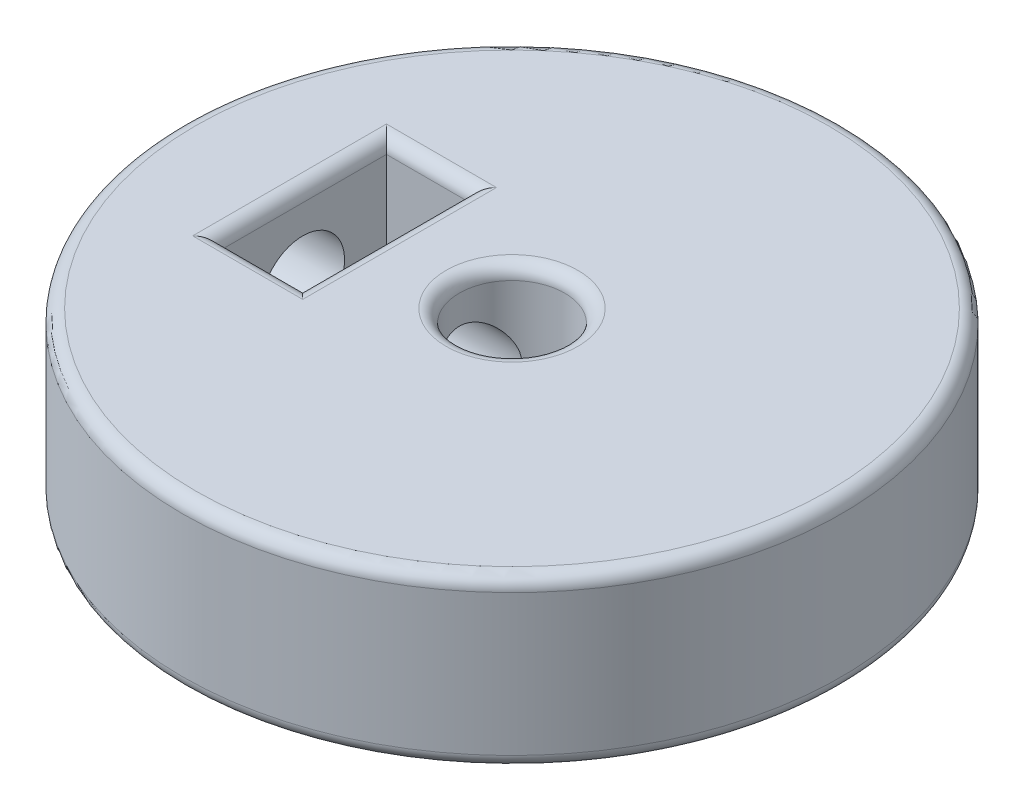
ISO-10303-21;
HEADER;
FILE_DESCRIPTION(('STEP AP214'),'2;1');
FILE_NAME('part.step','',(''),(''),'','','');
FILE_SCHEMA(('AUTOMOTIVE_DESIGN { 1 0 10303 214 1 1 1 1 }'));
ENDSEC;
DATA;
#1=APPLICATION_CONTEXT('core data for automotive mechanical design processes');
#2=APPLICATION_PROTOCOL_DEFINITION('international standard','automotive_design',2000,#1);
#3=PRODUCT_CONTEXT('',#1,'mechanical');
#4=PRODUCT('Part','Part','',(#3));
#5=PRODUCT_RELATED_PRODUCT_CATEGORY('part','',(#4));
#6=PRODUCT_DEFINITION_FORMATION('','',#4);
#7=PRODUCT_DEFINITION_CONTEXT('part definition',#1,'design');
#8=PRODUCT_DEFINITION('design','',#6,#7);
#9=PRODUCT_DEFINITION_SHAPE('','',#8);
#10=(LENGTH_UNIT() NAMED_UNIT(*) SI_UNIT(.MILLI.,.METRE.));
#11=(NAMED_UNIT(*) PLANE_ANGLE_UNIT() SI_UNIT($,.RADIAN.));
#12=(NAMED_UNIT(*) SI_UNIT($,.STERADIAN.) SOLID_ANGLE_UNIT());
#13=UNCERTAINTY_MEASURE_WITH_UNIT(LENGTH_MEASURE(1.E-05),#10,'distance_accuracy_value','');
#14=(GEOMETRIC_REPRESENTATION_CONTEXT(3) GLOBAL_UNCERTAINTY_ASSIGNED_CONTEXT((#13)) GLOBAL_UNIT_ASSIGNED_CONTEXT((#10,
#11,#12)) REPRESENTATION_CONTEXT('',''));
#15=CARTESIAN_POINT('',(0.,0.,0.));
#16=DIRECTION('',(0.,0.,1.));
#17=DIRECTION('',(1.,0.,0.));
#18=AXIS2_PLACEMENT_3D('',#15,#16,#17);
#19=CARTESIAN_POINT('',(0.,12.7,0.));
#20=DIRECTION('',(0.,1.,0.));
#21=DIRECTION('',(0.,0.,1.));
#22=AXIS2_PLACEMENT_3D('',#19,#20,#21);
#23=PLANE('',#22);
#24=CARTESIAN_POINT('',(0.,12.7,0.));
#25=DIRECTION('',(0.,1.,0.));
#26=DIRECTION('',(0.,0.,1.));
#27=AXIS2_PLACEMENT_3D('',#24,#25,#26);
#28=CIRCLE('',#27,5.);
#29=CARTESIAN_POINT('',(0.,12.7,5.));
#30=VERTEX_POINT('',#29);
#31=EDGE_CURVE('E11',#30,#30,#28,.F.);
#32=ORIENTED_EDGE('',*,*,#31,.T.);
#33=EDGE_LOOP('',(#32));
#34=FACE_BOUND('',#33,.T.);
#35=CARTESIAN_POINT('',(0.,12.7,0.));
#36=DIRECTION('',(0.,1.,0.));
#37=DIRECTION('',(0.,0.,1.));
#38=AXIS2_PLACEMENT_3D('',#35,#36,#37);
#39=CIRCLE('',#38,24.);
#40=CARTESIAN_POINT('',(0.,12.7,24.));
#41=VERTEX_POINT('',#40);
#42=EDGE_CURVE('E42',#41,#41,#39,.T.);
#43=ORIENTED_EDGE('',*,*,#42,.T.);
#44=EDGE_LOOP('',(#43));
#45=FACE_BOUND('',#44,.T.);
#46=DIRECTION('',(0.,0.,-1.));
#47=VECTOR('',#46,1.);
#48=CARTESIAN_POINT('',(-8.525,12.7,6.35));
#49=LINE('',#48,#47);
#50=CARTESIAN_POINT('',(-8.525,12.7,-7.35));
#51=VERTEX_POINT('',#50);
#52=CARTESIAN_POINT('',(-8.525,12.7,7.35));
#53=VERTEX_POINT('',#52);
#54=EDGE_CURVE('E50',#51,#53,#49,.F.);
#55=ORIENTED_EDGE('',*,*,#54,.T.);
#56=DIRECTION('',(1.,0.,0.));
#57=VECTOR('',#56,1.);
#58=CARTESIAN_POINT('',(-15.875,12.7,7.35));
#59=LINE('',#58,#57);
#60=CARTESIAN_POINT('',(-16.875,12.7,7.35));
#61=VERTEX_POINT('',#60);
#62=EDGE_CURVE('E168',#53,#61,#59,.F.);
#63=ORIENTED_EDGE('',*,*,#62,.T.);
#64=DIRECTION('',(0.,0.,1.));
#65=VECTOR('',#64,1.);
#66=CARTESIAN_POINT('',(-16.875,12.7,-6.35));
#67=LINE('',#66,#65);
#68=CARTESIAN_POINT('',(-16.875,12.7,-7.35));
#69=VERTEX_POINT('',#68);
#70=EDGE_CURVE('E164',#61,#69,#67,.F.);
#71=ORIENTED_EDGE('',*,*,#70,.T.);
#72=DIRECTION('',(-1.,0.,0.));
#73=VECTOR('',#72,1.);
#74=CARTESIAN_POINT('',(-9.525,12.7,-7.35));
#75=LINE('',#74,#73);
#76=EDGE_CURVE('E55',#69,#51,#75,.F.);
#77=ORIENTED_EDGE('',*,*,#76,.T.);
#78=EDGE_LOOP('',(#55,#63,#71,#77));
#79=FACE_BOUND('',#78,.T.);
#80=ADVANCED_FACE('F33',(#34,#45,#79),#23,.T.);
#81=CARTESIAN_POINT('',(0.,0.,0.));
#82=DIRECTION('',(0.,1.,0.));
#83=DIRECTION('',(0.,0.,1.));
#84=AXIS2_PLACEMENT_3D('',#81,#82,#83);
#85=PLANE('',#84);
#86=CARTESIAN_POINT('',(0.,0.,0.));
#87=DIRECTION('',(0.,1.,0.));
#88=DIRECTION('',(0.,0.,1.));
#89=AXIS2_PLACEMENT_3D('',#86,#87,#88);
#90=CIRCLE('',#89,5.);
#91=CARTESIAN_POINT('',(0.,0.,5.));
#92=VERTEX_POINT('',#91);
#93=EDGE_CURVE('E129',#92,#92,#90,.T.);
#94=ORIENTED_EDGE('',*,*,#93,.T.);
#95=EDGE_LOOP('',(#94));
#96=FACE_BOUND('',#95,.T.);
#97=CARTESIAN_POINT('',(0.,0.,0.));
#98=DIRECTION('',(0.,1.,0.));
#99=DIRECTION('',(0.,0.,1.));
#100=AXIS2_PLACEMENT_3D('',#97,#98,#99);
#101=CIRCLE('',#100,24.);
#102=CARTESIAN_POINT('',(0.,0.,24.));
#103=VERTEX_POINT('',#102);
#104=EDGE_CURVE('E126',#103,#103,#101,.F.);
#105=ORIENTED_EDGE('',*,*,#104,.T.);
#106=EDGE_LOOP('',(#105));
#107=FACE_BOUND('',#106,.T.);
#108=DIRECTION('',(1.,0.,0.));
#109=VECTOR('',#108,1.);
#110=CARTESIAN_POINT('',(0.,0.,7.35));
#111=LINE('',#110,#109);
#112=CARTESIAN_POINT('',(-16.875,0.,7.35));
#113=VERTEX_POINT('',#112);
#114=CARTESIAN_POINT('',(-8.525,0.,7.35));
#115=VERTEX_POINT('',#114);
#116=EDGE_CURVE('E124',#113,#115,#111,.T.);
#117=ORIENTED_EDGE('',*,*,#116,.T.);
#118=DIRECTION('',(0.,0.,-1.));
#119=VECTOR('',#118,1.);
#120=CARTESIAN_POINT('',(-8.525,0.,0.));
#121=LINE('',#120,#119);
#122=CARTESIAN_POINT('',(-8.525,0.,-7.35));
#123=VERTEX_POINT('',#122);
#124=EDGE_CURVE('E105',#115,#123,#121,.T.);
#125=ORIENTED_EDGE('',*,*,#124,.T.);
#126=DIRECTION('',(-1.,0.,0.));
#127=VECTOR('',#126,1.);
#128=CARTESIAN_POINT('',(0.,0.,-7.35));
#129=LINE('',#128,#127);
#130=CARTESIAN_POINT('',(-16.875,0.,-7.35));
#131=VERTEX_POINT('',#130);
#132=EDGE_CURVE('E113',#123,#131,#129,.T.);
#133=ORIENTED_EDGE('',*,*,#132,.T.);
#134=DIRECTION('',(0.,0.,1.));
#135=VECTOR('',#134,1.);
#136=CARTESIAN_POINT('',(-16.875,0.,0.));
#137=LINE('',#136,#135);
#138=EDGE_CURVE('E119',#131,#113,#137,.T.);
#139=ORIENTED_EDGE('',*,*,#138,.T.);
#140=EDGE_LOOP('',(#117,#125,#133,#139));
#141=FACE_BOUND('',#140,.T.);
#142=ADVANCED_FACE('F122',(#96,#107,#141),#85,.F.);
#143=CARTESIAN_POINT('',(0.,12.7,0.));
#144=DIRECTION('',(0.,-1.,0.));
#145=DIRECTION('',(0.,0.,-1.));
#146=AXIS2_PLACEMENT_3D('',#143,#144,#145);
#147=CYLINDRICAL_SURFACE('',#146,25.);
#148=CARTESIAN_POINT('',(0.,1.,0.));
#149=DIRECTION('',(0.,1.,0.));
#150=DIRECTION('',(0.,0.,1.));
#151=AXIS2_PLACEMENT_3D('',#148,#149,#150);
#152=CIRCLE('',#151,25.);
#153=CARTESIAN_POINT('',(0.,1.,25.));
#154=VERTEX_POINT('',#153);
#155=EDGE_CURVE('E145',#154,#154,#152,.T.);
#156=ORIENTED_EDGE('',*,*,#155,.T.);
#157=EDGE_LOOP('',(#156));
#158=FACE_BOUND('',#157,.T.);
#159=CARTESIAN_POINT('',(0.,11.7,0.));
#160=DIRECTION('',(0.,1.,0.));
#161=DIRECTION('',(0.,0.,1.));
#162=AXIS2_PLACEMENT_3D('',#159,#160,#161);
#163=CIRCLE('',#162,25.);
#164=CARTESIAN_POINT('',(0.,11.7,25.));
#165=VERTEX_POINT('',#164);
#166=EDGE_CURVE('E142',#165,#165,#163,.F.);
#167=ORIENTED_EDGE('',*,*,#166,.T.);
#168=EDGE_LOOP('',(#167));
#169=FACE_BOUND('',#168,.T.);
#170=CARTESIAN_POINT('',(-24.797567925101,6.35,3.175));
#171=CARTESIAN_POINT('',(-24.7975705111153,6.17243213556691,3.17499246488442));
#172=CARTESIAN_POINT('',(-24.7994957854187,5.99475386935248,3.16005350047622));
#173=CARTESIAN_POINT('',(-24.8069857822236,5.64434382883282,3.10069616760941));
#174=CARTESIAN_POINT('',(-24.8125542891275,5.47161739318907,3.05624714491254));
#175=CARTESIAN_POINT('',(-24.8266900800026,5.13623501662552,2.93920267061333));
#176=CARTESIAN_POINT('',(-24.8352553088008,4.97357226370485,2.8666265051399));
#177=CARTESIAN_POINT('',(-24.8544169866335,4.66276443719102,2.69542951653762));
#178=CARTESIAN_POINT('',(-24.8650130933379,4.51461692322219,2.59681308176825));
#179=CARTESIAN_POINT('',(-24.8871111076848,4.23615994171991,2.37572524836186));
#180=CARTESIAN_POINT('',(-24.8986174043297,4.10594639487242,2.25313346419816));
#181=CARTESIAN_POINT('',(-24.9211998808118,3.86788239527623,1.98783407816174));
#182=CARTESIAN_POINT('',(-24.9322760390685,3.76003306339586,1.84512546865908));
#183=CARTESIAN_POINT('',(-24.9527952489488,3.56941410294974,1.54303961209787));
#184=CARTESIAN_POINT('',(-24.9622325927008,3.48673140410834,1.38360709088167));
#185=CARTESIAN_POINT('',(-24.9783625733138,3.34934963950978,1.05297955301708));
#186=CARTESIAN_POINT('',(-24.9850553151895,3.29464950305568,0.88178498670425));
#187=CARTESIAN_POINT('',(-24.9949110868013,3.21507252010342,0.533474532777816));
#188=CARTESIAN_POINT('',(-24.9980929964501,3.19003609921958,0.356395645210083));
#189=CARTESIAN_POINT('',(-25.0006330769807,3.17000262602934,0.000523161879207299));
#190=CARTESIAN_POINT('',(-24.9999914028609,3.17500435605232,-0.178270364083485));
#191=CARTESIAN_POINT('',(-24.9949718771284,3.21477746194257,-0.531410916493321));
#192=CARTESIAN_POINT('',(-24.9906155651233,3.24937721514886,-0.705777621521635));
#193=CARTESIAN_POINT('',(-24.9786804186874,3.34709584436341,-1.04620950366429));
#194=CARTESIAN_POINT('',(-24.9711015213305,3.41021527726655,-1.2122745186038));
#195=CARTESIAN_POINT('',(-24.9535356796478,3.5633635418623,-1.5319194808604));
#196=CARTESIAN_POINT('',(-24.9435421171995,3.65346649545873,-1.68546353643283));
#197=CARTESIAN_POINT('',(-24.9222646991461,3.85797017447457,-1.97531651298108));
#198=CARTESIAN_POINT('',(-24.9109807824759,3.97237205004296,-2.1116246176345));
#199=CARTESIAN_POINT('',(-24.8882911823641,4.22318697762034,-2.36414493259857));
#200=CARTESIAN_POINT('',(-24.8768852014859,4.35974962071773,-2.48020858583094));
#201=CARTESIAN_POINT('',(-24.8553154999378,4.650496108363,-2.68779039058487));
#202=CARTESIAN_POINT('',(-24.8451517833919,4.80468001140565,-2.77930846062261));
#203=CARTESIAN_POINT('',(-24.8272175192573,5.12642632614193,-2.93521058217641));
#204=CARTESIAN_POINT('',(-24.8194480435255,5.29399468766026,-2.99958248559838));
#205=CARTESIAN_POINT('',(-24.8072026849506,5.63768337568026,-3.09923195072394));
#206=CARTESIAN_POINT('',(-24.8027266380763,5.81380327580206,-3.13451096142563));
#207=CARTESIAN_POINT('',(-24.797605000567,6.16828288496571,-3.17477594421986));
#208=CARTESIAN_POINT('',(-24.7969329608367,6.34661846600376,-3.17997109392002));
#209=CARTESIAN_POINT('',(-24.7994254571923,6.70161746404916,-3.16047303382613));
#210=CARTESIAN_POINT('',(-24.8025899087971,6.8782809177911,-3.13578048217115));
#211=CARTESIAN_POINT('',(-24.8123746861797,7.22429242137644,-3.0573841688366));
#212=CARTESIAN_POINT('',(-24.8189829180418,7.3936638403572,-3.00378190980876));
#213=CARTESIAN_POINT('',(-24.8349008549238,7.72101495843034,-2.86919231956576));
#214=CARTESIAN_POINT('',(-24.844210657748,7.87899424483768,-2.78820399688241));
#215=CARTESIAN_POINT('',(-24.8645460329794,8.18002239238931,-2.60062780236132));
#216=CARTESIAN_POINT('',(-24.8755806753657,8.32298523614153,-2.49390288652661));
#217=CARTESIAN_POINT('',(-24.8980940100877,8.5890441650551,-2.25807652458686));
#218=CARTESIAN_POINT('',(-24.9095727202498,8.71213945163094,-2.12897417944321));
#219=CARTESIAN_POINT('',(-24.9317621780304,8.93570505707448,-1.8511433798648));
#220=CARTESIAN_POINT('',(-24.942468003887,9.03603783799613,-1.70230380162546));
#221=CARTESIAN_POINT('',(-24.9618316259895,9.21027819490385,-1.38976321952467));
#222=CARTESIAN_POINT('',(-24.9704894646496,9.28418631816607,-1.22606252353712));
#223=CARTESIAN_POINT('',(-24.9847597817054,9.40325279769541,-0.888901562987893));
#224=CARTESIAN_POINT('',(-24.9903806400107,9.4484903248256,-0.715469626543086));
#225=CARTESIAN_POINT('',(-24.997978503271,9.50918894425159,-0.363395594728051));
#226=CARTESIAN_POINT('',(-24.999955678112,9.52465142480496,-0.184753742663709));
#227=CARTESIAN_POINT('',(-25.0000425342142,9.52533450193888,0.171326848386728));
#228=CARTESIAN_POINT('',(-24.9981793214637,9.51076705382339,0.348765211426045));
#229=CARTESIAN_POINT('',(-24.9908486889653,9.45225309831878,0.698649975529904));
#230=CARTESIAN_POINT('',(-24.9853812722949,9.40830661601526,0.871096380856751));
#231=CARTESIAN_POINT('',(-24.9714538077668,9.29234928429702,1.20607206893355));
#232=CARTESIAN_POINT('',(-24.9629948787404,9.22034892606127,1.36860503271975));
#233=CARTESIAN_POINT('',(-24.944020485655,9.05034964484947,1.67931514866989));
#234=CARTESIAN_POINT('',(-24.9335049939592,8.95235037248533,1.82749210787318));
#235=CARTESIAN_POINT('',(-24.9115023677594,8.73235212496935,2.10636636065139));
#236=CARTESIAN_POINT('',(-24.9000091496999,8.61019550543544,2.23693881939984));
#237=CARTESIAN_POINT('',(-24.8773949668057,8.34567814832511,2.47581403251147));
#238=CARTESIAN_POINT('',(-24.8662740907105,8.20331263617369,2.58411150931289));
#239=CARTESIAN_POINT('',(-24.8456164729263,7.90176645430856,2.77573335556741));
#240=CARTESIAN_POINT('',(-24.8360862208125,7.74252103513628,2.85895648434784));
#241=CARTESIAN_POINT('',(-24.8197649478406,7.41228150219584,2.99736015787212));
#242=CARTESIAN_POINT('',(-24.8129709593684,7.24130035333743,3.05257110020641));
#243=CARTESIAN_POINT('',(-24.8045352600869,6.94953536220229,3.12021529702867));
#244=CARTESIAN_POINT('',(-24.8019355824526,6.83058929993008,3.14072988058891));
#245=CARTESIAN_POINT('',(-24.798451043714,6.5911124536563,3.16812473644542));
#246=CARTESIAN_POINT('',(-24.7975661690066,6.4705816822336,3.17500511689948));
#247=CARTESIAN_POINT('',(-24.797567925101,6.35,3.175));
#248=B_SPLINE_CURVE_WITH_KNOTS('',3,(#170,#171,#172,#173,#174,#175,#176,#177,#178,#179,#180,
#181,#182,#183,#184,#185,#186,#187,#188,#189,#190,#191,#192,#193,#194,#195,#196,#197,#198,#199,
#200,#201,#202,#203,#204,#205,#206,#207,#208,#209,#210,#211,#212,#213,#214,#215,#216,#217,#218,
#219,#220,#221,#222,#223,#224,#225,#226,#227,#228,#229,#230,#231,#232,#233,#234,#235,#236,#237,
#238,#239,#240,#241,#242,#243,#244,#245,#246,#247),.UNSPECIFIED.,.T.,.F.,(4,2,2,2,2,2,2,2,2,2,2,
2,2,2,2,2,2,2,2,2,2,2,2,2,2,2,2,2,2,2,2,2,2,2,2,2,2,2,4),(0.,0.532263071490686,1.06507991014432,
1.59753205319812,2.12989452352983,2.66500211083327,3.20013651062548,3.73709890792682,
4.27404075789601,4.8080808501838,5.34209929398365,5.8730420859643,6.40399524594707,
6.93642048914645,7.46887093942598,8.00507773276948,8.54128630613354,9.07773458249488,
9.61415613894573,10.1468433548324,10.6795188409483,11.2103361516702,11.7411726818333,
12.274900810888,12.8086503880482,13.3455438932661,13.8824262783385,14.417819583971,
14.9531879263574,15.484790506873,16.0163926334746,16.5477961497848,17.0792068077572,
17.6142071001739,18.1493340033744,18.6865934504895,19.2232686336511,19.5847174008616,
19.9461633007494),.UNSPECIFIED.);
#249=CARTESIAN_POINT('',(-24.797567925101,6.35,3.175));
#250=VERTEX_POINT('',#249);
#251=EDGE_CURVE('E220',#250,#250,#248,.T.);
#252=ORIENTED_EDGE('',*,*,#251,.T.);
#253=EDGE_LOOP('',(#252));
#254=FACE_BOUND('',#253,.T.);
#255=ADVANCED_FACE('F205',(#158,#169,#254),#147,.T.);
#256=CARTESIAN_POINT('',(0.,12.7,0.));
#257=DIRECTION('',(0.,-1.,0.));
#258=DIRECTION('',(0.,0.,-1.));
#259=AXIS2_PLACEMENT_3D('',#256,#257,#258);
#260=CYLINDRICAL_SURFACE('',#259,4.);
#261=CARTESIAN_POINT('',(0.,1.,0.));
#262=DIRECTION('',(0.,1.,0.));
#263=DIRECTION('',(0.,0.,1.));
#264=AXIS2_PLACEMENT_3D('',#261,#262,#263);
#265=CIRCLE('',#264,4.);
#266=CARTESIAN_POINT('',(0.,1.,4.));
#267=VERTEX_POINT('',#266);
#268=EDGE_CURVE('E139',#267,#267,#265,.F.);
#269=ORIENTED_EDGE('',*,*,#268,.T.);
#270=EDGE_LOOP('',(#269));
#271=FACE_BOUND('',#270,.T.);
#272=CARTESIAN_POINT('',(0.,11.7,0.));
#273=DIRECTION('',(0.,1.,0.));
#274=DIRECTION('',(0.,0.,1.));
#275=AXIS2_PLACEMENT_3D('',#272,#273,#274);
#276=CIRCLE('',#275,4.);
#277=CARTESIAN_POINT('',(0.,11.7,4.));
#278=VERTEX_POINT('',#277);
#279=EDGE_CURVE('E136',#278,#278,#276,.T.);
#280=ORIENTED_EDGE('',*,*,#279,.T.);
#281=EDGE_LOOP('',(#280));
#282=FACE_BOUND('',#281,.T.);
#283=CARTESIAN_POINT('',(-2.43297657202037,6.35,3.175));
#284=CARTESIAN_POINT('',(-2.43297563895446,6.41029949032355,3.17500042190475));
#285=CARTESIAN_POINT('',(-2.43522955259405,6.47059448074604,3.17327780145405));
#286=CARTESIAN_POINT('',(-2.4441163663291,6.59067632315008,3.16643697214365));
#287=CARTESIAN_POINT('',(-2.45075084509443,6.65046298406916,3.16131753913599));
#288=CARTESIAN_POINT('',(-2.47681638584332,6.82851947405168,3.14100177263978));
#289=CARTESIAN_POINT('',(-2.50240859187216,6.94536472854407,3.12084831210991));
#290=CARTESIAN_POINT('',(-2.57684461168986,7.21161669624231,3.05987548717981));
#291=CARTESIAN_POINT('',(-2.63064871078757,7.35847950940346,3.01434369366378));
#292=CARTESIAN_POINT('',(-2.75082007198573,7.63993444656223,2.90509832072517));
#293=CARTESIAN_POINT('',(-2.81722391550403,7.77448910648631,2.84133151836432));
#294=CARTESIAN_POINT('',(-2.93290360799474,7.98945649444105,2.72077798183075));
#295=CARTESIAN_POINT('',(-2.98071814517193,8.07323507788825,2.66847662767658));
#296=CARTESIAN_POINT('',(-3.07722536022361,8.23525207197865,2.55658992661138));
#297=CARTESIAN_POINT('',(-3.1259183352533,8.31348856203385,2.49700207391049));
#298=CARTESIAN_POINT('',(-3.27111667134866,8.53957949297058,2.30759569011546));
#299=CARTESIAN_POINT('',(-3.36692720010315,8.67914094845494,2.16695109467304));
#300=CARTESIAN_POINT('',(-3.52937371930606,8.9077618862049,1.88794776610202));
#301=CARTESIAN_POINT('',(-3.59805792627394,9.00136356044217,1.75447600769418));
#302=CARTESIAN_POINT('',(-3.72313769691338,9.16877403365931,1.47044181946256));
#303=CARTESIAN_POINT('',(-3.77955222567088,9.24261342028626,1.31990632073839));
#304=CARTESIAN_POINT('',(-3.86772164752337,9.35682236565284,1.02953794935686));
#305=CARTESIAN_POINT('',(-3.90197543986879,9.40065318962536,0.891832644902823));
#306=CARTESIAN_POINT('',(-3.95597893767653,9.46943165525505,0.609018131770049));
#307=CARTESIAN_POINT('',(-3.9757364654684,9.49438948119417,0.463912961412422));
#308=CARTESIAN_POINT('',(-3.99912217372562,9.52390699199227,0.169829777325813));
#309=CARTESIAN_POINT('',(-4.00269655289534,9.52839863681949,0.0208404990658279));
#310=CARTESIAN_POINT('',(-3.99324079793562,9.51648230123948,-0.275763786242617));
#311=CARTESIAN_POINT('',(-3.98020965542984,9.50007305161788,-0.423378709284521));
#312=CARTESIAN_POINT('',(-3.93979897005493,9.4488498860313,-0.705123793030369));
#313=CARTESIAN_POINT('',(-3.91320507963964,9.41504288946496,-0.839555488471033));
#314=CARTESIAN_POINT('',(-3.84805848701017,9.33141989057038,-1.10023518555824));
#315=CARTESIAN_POINT('',(-3.80950280743773,9.28159990240497,-1.22648114025781));
#316=CARTESIAN_POINT('',(-3.71850678074136,9.16239195558659,-1.48077424899537));
#317=CARTESIAN_POINT('',(-3.66507604180218,9.09156483310958,-1.60778551554166));
#318=CARTESIAN_POINT('',(-3.54983302580677,8.93548058178062,-1.84838102881169));
#319=CARTESIAN_POINT('',(-3.48801577434111,8.85021488126664,-1.96195723119284));
#320=CARTESIAN_POINT('',(-3.34596115583078,8.64831969960778,-2.19705788225542));
#321=CARTESIAN_POINT('',(-3.26454804302871,8.52884524344942,-2.31542472574891));
#322=CARTESIAN_POINT('',(-3.09990016445489,8.27343474683816,-2.53161550326976));
#323=CARTESIAN_POINT('',(-3.0166634270512,8.13748008800652,-2.62941585498374));
#324=CARTESIAN_POINT('',(-2.864595310551,7.86583337560459,-2.79377293529783));
#325=CARTESIAN_POINT('',(-2.79519792210873,7.73184034185755,-2.86260917894124));
#326=CARTESIAN_POINT('',(-2.66756287301439,7.45095158599359,-2.98189632645067));
#327=CARTESIAN_POINT('',(-2.60930087071846,7.30408505512487,-3.03238755501825));
#328=CARTESIAN_POINT('',(-2.52740494449367,7.04213615453341,-3.10068214030973));
#329=CARTESIAN_POINT('',(-2.49863093017871,6.93006645071389,-3.12371061754234));
#330=CARTESIAN_POINT('',(-2.45568331043585,6.70145377142463,-3.15759261517575));
#331=CARTESIAN_POINT('',(-2.44147871839079,6.58492083872735,-3.16847197901441));
#332=CARTESIAN_POINT('',(-2.43013699096488,6.34989738438794,-3.17718484760942));
#333=CARTESIAN_POINT('',(-2.43308601179219,6.23139996685749,-3.17495249655771));
#334=CARTESIAN_POINT('',(-2.45567405699179,5.99692723832245,-3.15750554985297));
#335=CARTESIAN_POINT('',(-2.4753375426731,5.88095587941296,-3.1422719269479));
#336=CARTESIAN_POINT('',(-2.53517615053497,5.62377648903796,-3.09429932254376));
#337=CARTESIAN_POINT('',(-2.5794641087414,5.48423984395996,-3.05793676755679));
#338=CARTESIAN_POINT('',(-2.68153231965461,5.21561411164168,-2.96882989506837));
#339=CARTESIAN_POINT('',(-2.73935195944023,5.0865570336526,-2.91603760419397));
#340=CARTESIAN_POINT('',(-2.84452918278082,4.87424673068346,-2.81291000947329));
#341=CARTESIAN_POINT('',(-2.89020603166591,4.78838027118387,-2.76612073333459));
#342=CARTESIAN_POINT('',(-2.98339808593497,4.62198064024904,-2.66534082618223));
#343=CARTESIAN_POINT('',(-3.03091399304027,4.54144953702681,-2.61134742670318));
#344=CARTESIAN_POINT('',(-3.1263416597813,4.38571370989249,-2.49631376396731));
#345=CARTESIAN_POINT('',(-3.17425373082574,4.31051373301478,-2.43526734451554));
#346=CARTESIAN_POINT('',(-3.26918731626102,4.16569264902953,-2.30625851473953));
#347=CARTESIAN_POINT('',(-3.31620889875326,4.09607111397611,-2.23829663583915));
#348=CARTESIAN_POINT('',(-3.40874541932541,3.96199924131542,-2.09471505728136));
#349=CARTESIAN_POINT('',(-3.45423747652459,3.89761583850886,-2.01901785646128));
#350=CARTESIAN_POINT('',(-3.54202390493294,3.7754394316673,-1.86071495434319));
#351=CARTESIAN_POINT('',(-3.58431779096072,3.71764742691291,-1.77810820881413));
#352=CARTESIAN_POINT('',(-3.66445537515033,3.60953092825303,-1.60645789205143));
#353=CARTESIAN_POINT('',(-3.70231108951265,3.55918616955376,-1.51743280705918));
#354=CARTESIAN_POINT('',(-3.77254994949099,3.46665772095745,-1.33326051926386));
#355=CARTESIAN_POINT('',(-3.80493622723809,3.42446935819546,-1.23811686372784));
#356=CARTESIAN_POINT('',(-3.87339770105407,3.33588526457501,-1.00786859021501));
#357=CARTESIAN_POINT('',(-3.90677044011581,3.29322006183376,-0.870469681651901));
#358=CARTESIAN_POINT('',(-3.95904915756329,3.2266813999378,-0.588599229407276));
#359=CARTESIAN_POINT('',(-3.97796604444269,3.20279377069545,-0.444133106467933));
#360=CARTESIAN_POINT('',(-3.9998242546141,3.17520986173233,-0.15156987428556));
#361=CARTESIAN_POINT('',(-4.00271383666295,3.17157897701245,-0.00346255374259819));
#362=CARTESIAN_POINT('',(-3.99210904368819,3.184944619017,0.291224806779335));
#363=CARTESIAN_POINT('',(-3.97861264791299,3.20194368986872,0.437804656138957));
#364=CARTESIAN_POINT('',(-3.93740393926149,3.25419375470802,0.718362843164956));
#365=CARTESIAN_POINT('',(-3.91037706621805,3.28856540939092,0.85261051346814));
#366=CARTESIAN_POINT('',(-3.84442869603214,3.3732633103803,1.11283793427786));
#367=CARTESIAN_POINT('',(-3.80550417213221,3.42359361668303,1.23881557097304));
#368=CARTESIAN_POINT('',(-3.71370748025417,3.54394976006408,1.49278168462125));
#369=CARTESIAN_POINT('',(-3.65982736027762,3.61544565017099,1.61970227407995));
#370=CARTESIAN_POINT('',(-3.54374761467532,3.77286983172664,1.8600258213467));
#371=CARTESIAN_POINT('',(-3.48154278243917,3.85880716410645,1.97342023470567));
#372=CARTESIAN_POINT('',(-3.33866245916662,4.06229151959546,2.20814098269507));
#373=CARTESIAN_POINT('',(-3.25682456277333,4.18270179518838,2.3262740082686));
#374=CARTESIAN_POINT('',(-3.09152758142298,4.44003501947033,2.54182880653164));
#375=CARTESIAN_POINT('',(-3.00806698609598,4.57697403719075,2.63923016583848));
#376=CARTESIAN_POINT('',(-2.85681277914628,4.84895502007285,2.80167065522782));
#377=CARTESIAN_POINT('',(-2.78836059461387,4.98212128433227,2.86922642689785));
#378=CARTESIAN_POINT('',(-2.66261052130117,5.26113573319201,2.98627645385865));
#379=CARTESIAN_POINT('',(-2.60529610626822,5.40696465642346,3.03579756595511));
#380=CARTESIAN_POINT('',(-2.5194907428468,5.68473198618653,3.10721776437768));
#381=CARTESIAN_POINT('',(-2.4877367494809,5.81474137769549,3.13240396731287));
#382=CARTESIAN_POINT('',(-2.45525048331353,6.0135709766983,3.15783439654618));
#383=CARTESIAN_POINT('',(-2.44694660973289,6.08041472686523,3.16425279207708));
#384=CARTESIAN_POINT('',(-2.43581060119267,6.21484094600946,3.17283502750083));
#385=CARTESIAN_POINT('',(-2.43297761769283,6.28242329879328,3.17499952717791));
#386=CARTESIAN_POINT('',(-2.43297657202037,6.35,3.175));
#387=B_SPLINE_CURVE_WITH_KNOTS('',3,(#283,#284,#285,#286,#287,#288,#289,#290,#291,#292,#293,
#294,#295,#296,#297,#298,#299,#300,#301,#302,#303,#304,#305,#306,#307,#308,#309,#310,#311,#312,
#313,#314,#315,#316,#317,#318,#319,#320,#321,#322,#323,#324,#325,#326,#327,#328,#329,#330,#331,
#332,#333,#334,#335,#336,#337,#338,#339,#340,#341,#342,#343,#344,#345,#346,#347,#348,#349,#350,
#351,#352,#353,#354,#355,#356,#357,#358,#359,#360,#361,#362,#363,#364,#365,#366,#367,#368,#369,
#370,#371,#372,#373,#374,#375,#376,#377,#378,#379,#380,#381,#382,#383,#384,#385,#386),
.UNSPECIFIED.,.T.,.F.,(4,2,2,2,2,2,2,2,2,2,2,2,2,2,2,2,2,2,2,2,2,2,2,2,2,2,2,2,2,2,2,2,2,2,2,2,
2,2,2,2,2,2,2,2,2,2,2,2,2,2,2,4),(0.,0.180821762021812,0.36170872425734,0.723840477230649,
1.20992238441187,1.6974377694825,2.02624877696641,2.35517318058386,3.01178490797463,
3.5405485252562,4.06848893746244,4.51215249149207,4.95557646379746,5.40047353324293,
5.84539762051211,6.26706386922966,6.68883515742464,7.15193890821285,7.6153185570489,
8.17385831246803,8.73303505995211,9.22915917528767,9.72418605226217,10.0767877174286,
10.4286378955761,10.7822568070505,11.1363941260053,11.5864411743486,12.0378148487421,
12.3612315066179,12.6847728098596,13.0085986789987,13.3323996822529,13.6598409165122,
13.987331726288,14.3139143225082,14.6403092588509,15.0813929041016,15.5221433747737,
15.9643159037511,16.4065429678691,16.8283432251543,17.2502508776874,17.7145162669292,
18.179073395454,18.73951208896,19.3005000899876,19.7918318483723,20.2824289054567,
20.6885894509279,20.8912650257223,21.0939091628163),.UNSPECIFIED.);
#388=CARTESIAN_POINT('',(-2.43297657202037,6.35,3.175));
#389=VERTEX_POINT('',#388);
#390=EDGE_CURVE('E177',#389,#389,#387,.T.);
#391=ORIENTED_EDGE('',*,*,#390,.T.);
#392=EDGE_LOOP('',(#391));
#393=FACE_BOUND('',#392,.T.);
#394=ADVANCED_FACE('F210',(#271,#282,#393),#260,.F.);
#395=CARTESIAN_POINT('',(-15.875,0.,-6.35));
#396=DIRECTION('',(-1.,0.,0.));
#397=DIRECTION('',(0.,0.,1.));
#398=AXIS2_PLACEMENT_3D('',#395,#396,#397);
#399=PLANE('',#398);
#400=CARTESIAN_POINT('',(-15.875,6.35,0.));
#401=DIRECTION('',(-1.,0.,0.));
#402=DIRECTION('',(0.,0.,1.));
#403=AXIS2_PLACEMENT_3D('',#400,#401,#402);
#404=CIRCLE('',#403,3.175);
#405=CARTESIAN_POINT('',(-15.875,6.35,3.175));
#406=VERTEX_POINT('',#405);
#407=EDGE_CURVE('E229',#406,#406,#404,.T.);
#408=ORIENTED_EDGE('',*,*,#407,.T.);
#409=EDGE_LOOP('',(#408));
#410=FACE_BOUND('',#409,.T.);
#411=DIRECTION('',(0.,1.,0.));
#412=VECTOR('',#411,1.);
#413=CARTESIAN_POINT('',(-15.875,0.,6.35));
#414=LINE('',#413,#412);
#415=CARTESIAN_POINT('',(-15.875,1.,6.35));
#416=VERTEX_POINT('',#415);
#417=CARTESIAN_POINT('',(-15.875,11.7,6.35));
#418=VERTEX_POINT('',#417);
#419=EDGE_CURVE('E228',#416,#418,#414,.T.);
#420=ORIENTED_EDGE('',*,*,#419,.F.);
#421=DIRECTION('',(0.,0.,1.));
#422=VECTOR('',#421,1.);
#423=CARTESIAN_POINT('',(-15.875,1.,-6.35));
#424=LINE('',#423,#422);
#425=CARTESIAN_POINT('',(-15.875,1.,-6.35));
#426=VERTEX_POINT('',#425);
#427=EDGE_CURVE('E158',#416,#426,#424,.F.);
#428=ORIENTED_EDGE('',*,*,#427,.T.);
#429=DIRECTION('',(0.,1.,0.));
#430=VECTOR('',#429,1.);
#431=CARTESIAN_POINT('',(-15.875,0.,-6.35));
#432=LINE('',#431,#430);
#433=CARTESIAN_POINT('',(-15.875,11.7,-6.35));
#434=VERTEX_POINT('',#433);
#435=EDGE_CURVE('E120',#426,#434,#432,.T.);
#436=ORIENTED_EDGE('',*,*,#435,.T.);
#437=DIRECTION('',(0.,0.,1.));
#438=VECTOR('',#437,1.);
#439=CARTESIAN_POINT('',(-15.875,11.7,6.35));
#440=LINE('',#439,#438);
#441=EDGE_CURVE('E156',#434,#418,#440,.T.);
#442=ORIENTED_EDGE('',*,*,#441,.T.);
#443=EDGE_LOOP('',(#420,#428,#436,#442));
#444=FACE_BOUND('',#443,.T.);
#445=ADVANCED_FACE('F277',(#410,#444),#399,.F.);
#446=CARTESIAN_POINT('',(-15.875,0.,-6.35));
#447=DIRECTION('',(0.,0.,-1.));
#448=DIRECTION('',(-1.,0.,0.));
#449=AXIS2_PLACEMENT_3D('',#446,#447,#448);
#450=PLANE('',#449);
#451=ORIENTED_EDGE('',*,*,#435,.F.);
#452=DIRECTION('',(-1.,0.,0.));
#453=VECTOR('',#452,1.);
#454=CARTESIAN_POINT('',(-15.875,1.,-6.35));
#455=LINE('',#454,#453);
#456=CARTESIAN_POINT('',(-9.525,1.,-6.35));
#457=VERTEX_POINT('',#456);
#458=EDGE_CURVE('E162',#426,#457,#455,.F.);
#459=ORIENTED_EDGE('',*,*,#458,.T.);
#460=DIRECTION('',(0.,1.,0.));
#461=VECTOR('',#460,1.);
#462=CARTESIAN_POINT('',(-9.525,0.,-6.35));
#463=LINE('',#462,#461);
#464=CARTESIAN_POINT('',(-9.525,11.7,-6.35));
#465=VERTEX_POINT('',#464);
#466=EDGE_CURVE('E274',#457,#465,#463,.T.);
#467=ORIENTED_EDGE('',*,*,#466,.T.);
#468=DIRECTION('',(-1.,0.,0.));
#469=VECTOR('',#468,1.);
#470=CARTESIAN_POINT('',(-15.875,11.7,-6.35));
#471=LINE('',#470,#469);
#472=EDGE_CURVE('E160',#465,#434,#471,.T.);
#473=ORIENTED_EDGE('',*,*,#472,.T.);
#474=EDGE_LOOP('',(#451,#459,#467,#473));
#475=FACE_BOUND('',#474,.T.);
#476=ADVANCED_FACE('F240',(#475),#450,.F.);
#477=CARTESIAN_POINT('',(-9.525,0.,-6.35));
#478=DIRECTION('',(1.,0.,0.));
#479=DIRECTION('',(0.,0.,-1.));
#480=AXIS2_PLACEMENT_3D('',#477,#478,#479);
#481=PLANE('',#480);
#482=CARTESIAN_POINT('',(-9.525,6.35,0.));
#483=DIRECTION('',(1.,0.,0.));
#484=DIRECTION('',(0.,0.,-1.));
#485=AXIS2_PLACEMENT_3D('',#482,#483,#484);
#486=CIRCLE('',#485,3.175);
#487=CARTESIAN_POINT('',(-9.525,6.35,-3.175));
#488=VERTEX_POINT('',#487);
#489=EDGE_CURVE('E247',#488,#488,#486,.T.);
#490=ORIENTED_EDGE('',*,*,#489,.T.);
#491=EDGE_LOOP('',(#490));
#492=FACE_BOUND('',#491,.T.);
#493=ORIENTED_EDGE('',*,*,#466,.F.);
#494=DIRECTION('',(0.,0.,-1.));
#495=VECTOR('',#494,1.);
#496=CARTESIAN_POINT('',(-9.525,1.,-6.35));
#497=LINE('',#496,#495);
#498=CARTESIAN_POINT('',(-9.525,1.,6.35));
#499=VERTEX_POINT('',#498);
#500=EDGE_CURVE('E107',#457,#499,#497,.F.);
#501=ORIENTED_EDGE('',*,*,#500,.T.);
#502=DIRECTION('',(0.,1.,0.));
#503=VECTOR('',#502,1.);
#504=CARTESIAN_POINT('',(-9.525,0.,6.35));
#505=LINE('',#504,#503);
#506=CARTESIAN_POINT('',(-9.525,11.7,6.35));
#507=VERTEX_POINT('',#506);
#508=EDGE_CURVE('E272',#499,#507,#505,.T.);
#509=ORIENTED_EDGE('',*,*,#508,.T.);
#510=DIRECTION('',(0.,0.,-1.));
#511=VECTOR('',#510,1.);
#512=CARTESIAN_POINT('',(-9.525,11.7,-6.35));
#513=LINE('',#512,#511);
#514=EDGE_CURVE('E148',#507,#465,#513,.T.);
#515=ORIENTED_EDGE('',*,*,#514,.T.);
#516=EDGE_LOOP('',(#493,#501,#509,#515));
#517=FACE_BOUND('',#516,.T.);
#518=ADVANCED_FACE('F271',(#492,#517),#481,.F.);
#519=CARTESIAN_POINT('',(-15.875,0.,6.35));
#520=DIRECTION('',(0.,0.,1.));
#521=DIRECTION('',(1.,0.,0.));
#522=AXIS2_PLACEMENT_3D('',#519,#520,#521);
#523=PLANE('',#522);
#524=ORIENTED_EDGE('',*,*,#508,.F.);
#525=DIRECTION('',(1.,0.,0.));
#526=VECTOR('',#525,1.);
#527=CARTESIAN_POINT('',(-15.875,1.,6.35));
#528=LINE('',#527,#526);
#529=EDGE_CURVE('E154',#499,#416,#528,.F.);
#530=ORIENTED_EDGE('',*,*,#529,.T.);
#531=ORIENTED_EDGE('',*,*,#419,.T.);
#532=DIRECTION('',(1.,0.,0.));
#533=VECTOR('',#532,1.);
#534=CARTESIAN_POINT('',(-9.525,11.7,6.35));
#535=LINE('',#534,#533);
#536=EDGE_CURVE('E151',#418,#507,#535,.T.);
#537=ORIENTED_EDGE('',*,*,#536,.T.);
#538=EDGE_LOOP('',(#524,#530,#531,#537));
#539=FACE_BOUND('',#538,.T.);
#540=ADVANCED_FACE('F275',(#539),#523,.F.);
#541=CARTESIAN_POINT('',(25.001,6.35,0.));
#542=DIRECTION('',(-1.,0.,0.));
#543=DIRECTION('',(0.,0.,1.));
#544=AXIS2_PLACEMENT_3D('',#541,#542,#543);
#545=CYLINDRICAL_SURFACE('',#544,3.175);
#546=ORIENTED_EDGE('',*,*,#390,.F.);
#547=EDGE_LOOP('',(#546));
#548=FACE_BOUND('',#547,.T.);
#549=ORIENTED_EDGE('',*,*,#489,.F.);
#550=EDGE_LOOP('',(#549));
#551=FACE_BOUND('',#550,.T.);
#552=ADVANCED_FACE('F237',(#548,#551),#545,.F.);
#553=ORIENTED_EDGE('',*,*,#407,.F.);
#554=EDGE_LOOP('',(#553));
#555=FACE_BOUND('',#554,.T.);
#556=ORIENTED_EDGE('',*,*,#251,.F.);
#557=EDGE_LOOP('',(#556));
#558=FACE_BOUND('',#557,.T.);
#559=ADVANCED_FACE('F232',(#555,#558),#545,.F.);
#560=CARTESIAN_POINT('',(0.,1.,0.));
#561=DIRECTION('',(0.,1.,0.));
#562=DIRECTION('',(0.,0.,1.));
#563=AXIS2_PLACEMENT_3D('',#560,#561,#562);
#564=TOROIDAL_SURFACE('',#563,5.,1.);
#565=ORIENTED_EDGE('',*,*,#268,.F.);
#566=EDGE_LOOP('',(#565));
#567=FACE_BOUND('',#566,.T.);
#568=ORIENTED_EDGE('',*,*,#93,.F.);
#569=EDGE_LOOP('',(#568));
#570=FACE_BOUND('',#569,.T.);
#571=ADVANCED_FACE('F217',(#567,#570),#564,.T.);
#572=CARTESIAN_POINT('',(0.,1.,0.));
#573=DIRECTION('',(0.,1.,0.));
#574=DIRECTION('',(0.,0.,1.));
#575=AXIS2_PLACEMENT_3D('',#572,#573,#574);
#576=TOROIDAL_SURFACE('',#575,24.,1.);
#577=ORIENTED_EDGE('',*,*,#104,.F.);
#578=EDGE_LOOP('',(#577));
#579=FACE_BOUND('',#578,.T.);
#580=ORIENTED_EDGE('',*,*,#155,.F.);
#581=EDGE_LOOP('',(#580));
#582=FACE_BOUND('',#581,.T.);
#583=ADVANCED_FACE('F310',(#579,#582),#576,.T.);
#584=CARTESIAN_POINT('',(-16.875,1.,0.));
#585=DIRECTION('',(0.,0.,1.));
#586=DIRECTION('',(1.,0.,0.));
#587=AXIS2_PLACEMENT_3D('',#584,#585,#586);
#588=CYLINDRICAL_SURFACE('',#587,1.);
#589=CARTESIAN_POINT('',(-16.875,1.,-7.35));
#590=DIRECTION('',(-0.707106781186547,0.,0.707106781186548));
#591=DIRECTION('',(0.707106781186548,0.,0.707106781186547));
#592=AXIS2_PLACEMENT_3D('',#589,#590,#591);
#593=ELLIPSE('',#592,1.4142135623731,1.);
#594=EDGE_CURVE('E116',#426,#131,#593,.F.);
#595=ORIENTED_EDGE('',*,*,#594,.F.);
#596=ORIENTED_EDGE('',*,*,#427,.F.);
#597=CARTESIAN_POINT('',(-16.875,1.,7.35));
#598=DIRECTION('',(0.707106781186548,0.,0.707106781186547));
#599=DIRECTION('',(0.707106781186547,0.,-0.707106781186548));
#600=AXIS2_PLACEMENT_3D('',#597,#598,#599);
#601=ELLIPSE('',#600,1.41421356237309,1.);
#602=EDGE_CURVE('E174',#113,#416,#601,.T.);
#603=ORIENTED_EDGE('',*,*,#602,.F.);
#604=ORIENTED_EDGE('',*,*,#138,.F.);
#605=EDGE_LOOP('',(#595,#596,#603,#604));
#606=FACE_BOUND('',#605,.T.);
#607=ADVANCED_FACE('F260',(#606),#588,.T.);
#608=CARTESIAN_POINT('',(0.,1.,7.35));
#609=DIRECTION('',(1.,0.,0.));
#610=DIRECTION('',(0.,0.,-1.));
#611=AXIS2_PLACEMENT_3D('',#608,#609,#610);
#612=CYLINDRICAL_SURFACE('',#611,1.);
#613=ORIENTED_EDGE('',*,*,#602,.T.);
#614=ORIENTED_EDGE('',*,*,#529,.F.);
#615=CARTESIAN_POINT('',(-8.525,1.,7.35));
#616=DIRECTION('',(0.707106781186547,0.,-0.707106781186548));
#617=DIRECTION('',(-0.707106781186548,0.,-0.707106781186547));
#618=AXIS2_PLACEMENT_3D('',#615,#616,#617);
#619=ELLIPSE('',#618,1.4142135623731,1.);
#620=EDGE_CURVE('E110',#115,#499,#619,.T.);
#621=ORIENTED_EDGE('',*,*,#620,.F.);
#622=ORIENTED_EDGE('',*,*,#116,.F.);
#623=EDGE_LOOP('',(#613,#614,#621,#622));
#624=FACE_BOUND('',#623,.T.);
#625=ADVANCED_FACE('F263',(#624),#612,.T.);
#626=CARTESIAN_POINT('',(0.,1.,-7.35));
#627=DIRECTION('',(-1.,0.,0.));
#628=DIRECTION('',(0.,0.,1.));
#629=AXIS2_PLACEMENT_3D('',#626,#627,#628);
#630=CYLINDRICAL_SURFACE('',#629,1.);
#631=ORIENTED_EDGE('',*,*,#594,.T.);
#632=ORIENTED_EDGE('',*,*,#132,.F.);
#633=CARTESIAN_POINT('',(-8.525,1.,-7.35));
#634=DIRECTION('',(-0.707106781186548,0.,-0.707106781186547));
#635=DIRECTION('',(0.707106781186547,0.,-0.707106781186548));
#636=AXIS2_PLACEMENT_3D('',#633,#634,#635);
#637=ELLIPSE('',#636,1.41421356237309,1.);
#638=EDGE_CURVE('E101',#457,#123,#637,.F.);
#639=ORIENTED_EDGE('',*,*,#638,.F.);
#640=ORIENTED_EDGE('',*,*,#458,.F.);
#641=EDGE_LOOP('',(#631,#632,#639,#640));
#642=FACE_BOUND('',#641,.T.);
#643=ADVANCED_FACE('F114',(#642),#630,.T.);
#644=CARTESIAN_POINT('',(-8.525,1.,0.));
#645=DIRECTION('',(0.,0.,-1.));
#646=DIRECTION('',(-1.,0.,0.));
#647=AXIS2_PLACEMENT_3D('',#644,#645,#646);
#648=CYLINDRICAL_SURFACE('',#647,1.);
#649=ORIENTED_EDGE('',*,*,#620,.T.);
#650=ORIENTED_EDGE('',*,*,#500,.F.);
#651=ORIENTED_EDGE('',*,*,#638,.T.);
#652=ORIENTED_EDGE('',*,*,#124,.F.);
#653=EDGE_LOOP('',(#649,#650,#651,#652));
#654=FACE_BOUND('',#653,.T.);
#655=ADVANCED_FACE('F103',(#654),#648,.T.);
#656=CARTESIAN_POINT('',(0.,11.7,0.));
#657=DIRECTION('',(0.,1.,0.));
#658=DIRECTION('',(0.,0.,1.));
#659=AXIS2_PLACEMENT_3D('',#656,#657,#658);
#660=TOROIDAL_SURFACE('',#659,5.,1.);
#661=ORIENTED_EDGE('',*,*,#31,.F.);
#662=EDGE_LOOP('',(#661));
#663=FACE_BOUND('',#662,.T.);
#664=ORIENTED_EDGE('',*,*,#279,.F.);
#665=EDGE_LOOP('',(#664));
#666=FACE_BOUND('',#665,.T.);
#667=ADVANCED_FACE('F341',(#663,#666),#660,.T.);
#668=CARTESIAN_POINT('',(0.,11.7,0.));
#669=DIRECTION('',(0.,1.,0.));
#670=DIRECTION('',(0.,0.,1.));
#671=AXIS2_PLACEMENT_3D('',#668,#669,#670);
#672=TOROIDAL_SURFACE('',#671,24.,1.);
#673=ORIENTED_EDGE('',*,*,#166,.F.);
#674=EDGE_LOOP('',(#673));
#675=FACE_BOUND('',#674,.T.);
#676=ORIENTED_EDGE('',*,*,#42,.F.);
#677=EDGE_LOOP('',(#676));
#678=FACE_BOUND('',#677,.T.);
#679=ADVANCED_FACE('F348',(#675,#678),#672,.T.);
#680=CARTESIAN_POINT('',(-15.875,11.7,-7.35));
#681=DIRECTION('',(1.,0.,0.));
#682=DIRECTION('',(0.,0.,-1.));
#683=AXIS2_PLACEMENT_3D('',#680,#681,#682);
#684=CYLINDRICAL_SURFACE('',#683,1.);
#685=CARTESIAN_POINT('',(-8.525,11.7,-7.35));
#686=DIRECTION('',(0.707106781186548,0.,0.707106781186547));
#687=DIRECTION('',(-0.707106781186547,0.,0.707106781186548));
#688=AXIS2_PLACEMENT_3D('',#685,#686,#687);
#689=ELLIPSE('',#688,1.41421356237309,1.);
#690=EDGE_CURVE('E181',#51,#465,#689,.T.);
#691=ORIENTED_EDGE('',*,*,#690,.F.);
#692=ORIENTED_EDGE('',*,*,#76,.F.);
#693=CARTESIAN_POINT('',(-16.875,11.7,-7.35));
#694=DIRECTION('',(0.707106781186547,0.,-0.707106781186548));
#695=DIRECTION('',(0.707106781186548,0.,0.707106781186547));
#696=AXIS2_PLACEMENT_3D('',#693,#694,#695);
#697=ELLIPSE('',#696,1.4142135623731,1.);
#698=EDGE_CURVE('E37',#434,#69,#697,.F.);
#699=ORIENTED_EDGE('',*,*,#698,.F.);
#700=ORIENTED_EDGE('',*,*,#472,.F.);
#701=EDGE_LOOP('',(#691,#692,#699,#700));
#702=FACE_BOUND('',#701,.T.);
#703=ADVANCED_FACE('F35',(#702),#684,.T.);
#704=CARTESIAN_POINT('',(-16.875,11.7,-6.35));
#705=DIRECTION('',(0.,0.,-1.));
#706=DIRECTION('',(-1.,0.,0.));
#707=AXIS2_PLACEMENT_3D('',#704,#705,#706);
#708=CYLINDRICAL_SURFACE('',#707,1.);
#709=ORIENTED_EDGE('',*,*,#698,.T.);
#710=ORIENTED_EDGE('',*,*,#70,.F.);
#711=CARTESIAN_POINT('',(-16.875,11.7,7.35));
#712=DIRECTION('',(-0.707106781186548,0.,-0.707106781186547));
#713=DIRECTION('',(-0.707106781186547,0.,0.707106781186548));
#714=AXIS2_PLACEMENT_3D('',#711,#712,#713);
#715=ELLIPSE('',#714,1.41421356237309,1.);
#716=EDGE_CURVE('E180',#418,#61,#715,.F.);
#717=ORIENTED_EDGE('',*,*,#716,.F.);
#718=ORIENTED_EDGE('',*,*,#441,.F.);
#719=EDGE_LOOP('',(#709,#710,#717,#718));
#720=FACE_BOUND('',#719,.T.);
#721=ADVANCED_FACE('F190',(#720),#708,.T.);
#722=CARTESIAN_POINT('',(-8.525,11.7,-6.35));
#723=DIRECTION('',(0.,0.,1.));
#724=DIRECTION('',(1.,0.,0.));
#725=AXIS2_PLACEMENT_3D('',#722,#723,#724);
#726=CYLINDRICAL_SURFACE('',#725,1.);
#727=ORIENTED_EDGE('',*,*,#690,.T.);
#728=ORIENTED_EDGE('',*,*,#514,.F.);
#729=CARTESIAN_POINT('',(-8.525,11.7,7.35));
#730=DIRECTION('',(-0.707106781186547,0.,0.707106781186548));
#731=DIRECTION('',(-0.707106781186548,0.,-0.707106781186547));
#732=AXIS2_PLACEMENT_3D('',#729,#730,#731);
#733=ELLIPSE('',#732,1.4142135623731,1.);
#734=EDGE_CURVE('E178',#53,#507,#733,.T.);
#735=ORIENTED_EDGE('',*,*,#734,.F.);
#736=ORIENTED_EDGE('',*,*,#54,.F.);
#737=EDGE_LOOP('',(#727,#728,#735,#736));
#738=FACE_BOUND('',#737,.T.);
#739=ADVANCED_FACE('F195',(#738),#726,.T.);
#740=CARTESIAN_POINT('',(-15.875,11.7,7.35));
#741=DIRECTION('',(-1.,0.,0.));
#742=DIRECTION('',(0.,0.,1.));
#743=AXIS2_PLACEMENT_3D('',#740,#741,#742);
#744=CYLINDRICAL_SURFACE('',#743,1.);
#745=ORIENTED_EDGE('',*,*,#716,.T.);
#746=ORIENTED_EDGE('',*,*,#62,.F.);
#747=ORIENTED_EDGE('',*,*,#734,.T.);
#748=ORIENTED_EDGE('',*,*,#536,.F.);
#749=EDGE_LOOP('',(#745,#746,#747,#748));
#750=FACE_BOUND('',#749,.T.);
#751=ADVANCED_FACE('F198',(#750),#744,.T.);
#752=CLOSED_SHELL('',(#80,#142,#255,#394,#445,#476,#518,#540,#552,#559,#571,#583,#607,#625,#643,
#655,#667,#679,#703,#721,#739,#751));
#753=MANIFOLD_SOLID_BREP('B2',#752);
#754=ADVANCED_BREP_SHAPE_REPRESENTATION('',(#18,#753),#14);
#755=SHAPE_DEFINITION_REPRESENTATION(#9,#754);
ENDSEC;
END-ISO-10303-21;
